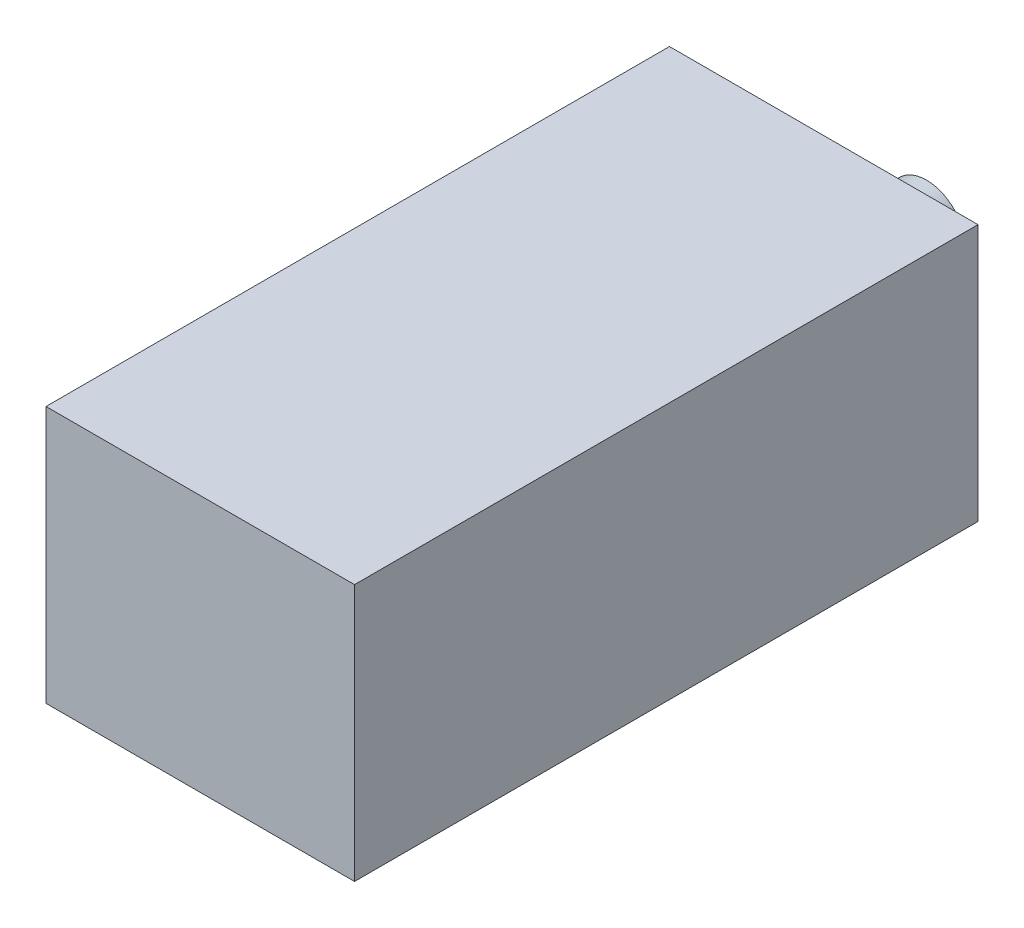
ISO-10303-21;
HEADER;
FILE_DESCRIPTION(('STEP AP214'),'2;1');
FILE_NAME('part.step','',(''),(''),'','','');
FILE_SCHEMA(('AUTOMOTIVE_DESIGN { 1 0 10303 214 1 1 1 1 }'));
ENDSEC;
DATA;
#1=APPLICATION_CONTEXT('core data for automotive mechanical design processes');
#2=APPLICATION_PROTOCOL_DEFINITION('international standard','automotive_design',2000,#1);
#3=PRODUCT_CONTEXT('',#1,'mechanical');
#4=PRODUCT('Part','Part','',(#3));
#5=PRODUCT_RELATED_PRODUCT_CATEGORY('part','',(#4));
#6=PRODUCT_DEFINITION_FORMATION('','',#4);
#7=PRODUCT_DEFINITION_CONTEXT('part definition',#1,'design');
#8=PRODUCT_DEFINITION('design','',#6,#7);
#9=PRODUCT_DEFINITION_SHAPE('','',#8);
#10=(LENGTH_UNIT() NAMED_UNIT(*) SI_UNIT(.MILLI.,.METRE.));
#11=(NAMED_UNIT(*) PLANE_ANGLE_UNIT() SI_UNIT($,.RADIAN.));
#12=(NAMED_UNIT(*) SI_UNIT($,.STERADIAN.) SOLID_ANGLE_UNIT());
#13=UNCERTAINTY_MEASURE_WITH_UNIT(LENGTH_MEASURE(1.E-05),#10,'distance_accuracy_value','');
#14=(GEOMETRIC_REPRESENTATION_CONTEXT(3) GLOBAL_UNCERTAINTY_ASSIGNED_CONTEXT((#13)) GLOBAL_UNIT_ASSIGNED_CONTEXT((#10,
#11,#12)) REPRESENTATION_CONTEXT('',''));
#15=CARTESIAN_POINT('',(0.,0.,0.));
#16=DIRECTION('',(0.,0.,1.));
#17=DIRECTION('',(1.,0.,0.));
#18=AXIS2_PLACEMENT_3D('',#15,#16,#17);
#19=CARTESIAN_POINT('',(0.,0.,24.25));
#20=DIRECTION('',(1.,0.,0.));
#21=DIRECTION('',(0.,1.,0.));
#22=AXIS2_PLACEMENT_3D('',#19,#20,#21);
#23=PLANE('',#22);
#24=DIRECTION('',(0.,-1.,0.));
#25=VECTOR('',#24,1.);
#26=CARTESIAN_POINT('',(0.,0.,0.));
#27=LINE('',#26,#25);
#28=CARTESIAN_POINT('',(0.,0.,0.));
#29=VERTEX_POINT('',#28);
#30=CARTESIAN_POINT('',(0.,-10.,0.));
#31=VERTEX_POINT('',#30);
#32=EDGE_CURVE('E110',#29,#31,#27,.T.);
#33=ORIENTED_EDGE('',*,*,#32,.T.);
#34=DIRECTION('',(0.,0.,-1.));
#35=VECTOR('',#34,1.);
#36=CARTESIAN_POINT('',(0.,-10.,24.25));
#37=LINE('',#36,#35);
#38=CARTESIAN_POINT('',(0.,-10.,24.25));
#39=VERTEX_POINT('',#38);
#40=EDGE_CURVE('E48',#39,#31,#37,.T.);
#41=ORIENTED_EDGE('',*,*,#40,.F.);
#42=DIRECTION('',(0.,-1.,0.));
#43=VECTOR('',#42,1.);
#44=CARTESIAN_POINT('',(0.,0.,24.25));
#45=LINE('',#44,#43);
#46=CARTESIAN_POINT('',(0.,0.,24.25));
#47=VERTEX_POINT('',#46);
#48=EDGE_CURVE('E92',#47,#39,#45,.T.);
#49=ORIENTED_EDGE('',*,*,#48,.F.);
#50=DIRECTION('',(0.,0.,-1.));
#51=VECTOR('',#50,1.);
#52=CARTESIAN_POINT('',(0.,0.,24.25));
#53=LINE('',#52,#51);
#54=EDGE_CURVE('E106',#47,#29,#53,.T.);
#55=ORIENTED_EDGE('',*,*,#54,.T.);
#56=EDGE_LOOP('',(#33,#41,#49,#55));
#57=FACE_BOUND('',#56,.T.);
#58=ADVANCED_FACE('F39',(#57),#23,.F.);
#59=CARTESIAN_POINT('',(0.,-10.,24.25));
#60=DIRECTION('',(0.,1.,0.));
#61=DIRECTION('',(0.,0.,1.));
#62=AXIS2_PLACEMENT_3D('',#59,#60,#61);
#63=PLANE('',#62);
#64=DIRECTION('',(1.,0.,0.));
#65=VECTOR('',#64,1.);
#66=CARTESIAN_POINT('',(0.,-10.,0.));
#67=LINE('',#66,#65);
#68=CARTESIAN_POINT('',(12.,-10.,0.));
#69=VERTEX_POINT('',#68);
#70=EDGE_CURVE('E98',#31,#69,#67,.T.);
#71=ORIENTED_EDGE('',*,*,#70,.T.);
#72=DIRECTION('',(0.,0.,-1.));
#73=VECTOR('',#72,1.);
#74=CARTESIAN_POINT('',(12.,-10.,24.25));
#75=LINE('',#74,#73);
#76=CARTESIAN_POINT('',(12.,-10.,24.25));
#77=VERTEX_POINT('',#76);
#78=EDGE_CURVE('E96',#77,#69,#75,.T.);
#79=ORIENTED_EDGE('',*,*,#78,.F.);
#80=DIRECTION('',(1.,0.,0.));
#81=VECTOR('',#80,1.);
#82=CARTESIAN_POINT('',(0.,-10.,24.25));
#83=LINE('',#82,#81);
#84=EDGE_CURVE('E87',#39,#77,#83,.T.);
#85=ORIENTED_EDGE('',*,*,#84,.F.);
#86=ORIENTED_EDGE('',*,*,#40,.T.);
#87=EDGE_LOOP('',(#71,#79,#85,#86));
#88=FACE_BOUND('',#87,.T.);
#89=ADVANCED_FACE('F97',(#88),#63,.F.);
#90=CARTESIAN_POINT('',(12.,0.,24.25));
#91=DIRECTION('',(-1.,0.,0.));
#92=DIRECTION('',(0.,-1.,0.));
#93=AXIS2_PLACEMENT_3D('',#90,#91,#92);
#94=PLANE('',#93);
#95=DIRECTION('',(0.,1.,0.));
#96=VECTOR('',#95,1.);
#97=CARTESIAN_POINT('',(12.,0.,0.));
#98=LINE('',#97,#96);
#99=CARTESIAN_POINT('',(12.,0.,0.));
#100=VERTEX_POINT('',#99);
#101=EDGE_CURVE('E73',#69,#100,#98,.T.);
#102=ORIENTED_EDGE('',*,*,#101,.T.);
#103=DIRECTION('',(0.,0.,-1.));
#104=VECTOR('',#103,1.);
#105=CARTESIAN_POINT('',(12.,0.,24.25));
#106=LINE('',#105,#104);
#107=CARTESIAN_POINT('',(12.,0.,24.25));
#108=VERTEX_POINT('',#107);
#109=EDGE_CURVE('E100',#108,#100,#106,.T.);
#110=ORIENTED_EDGE('',*,*,#109,.F.);
#111=DIRECTION('',(0.,1.,0.));
#112=VECTOR('',#111,1.);
#113=CARTESIAN_POINT('',(12.,0.,24.25));
#114=LINE('',#113,#112);
#115=EDGE_CURVE('E90',#77,#108,#114,.T.);
#116=ORIENTED_EDGE('',*,*,#115,.F.);
#117=ORIENTED_EDGE('',*,*,#78,.T.);
#118=EDGE_LOOP('',(#102,#110,#116,#117));
#119=FACE_BOUND('',#118,.T.);
#120=ADVANCED_FACE('F102',(#119),#94,.F.);
#121=CARTESIAN_POINT('',(0.,0.,24.25));
#122=DIRECTION('',(0.,-1.,0.));
#123=DIRECTION('',(0.,0.,-1.));
#124=AXIS2_PLACEMENT_3D('',#121,#122,#123);
#125=PLANE('',#124);
#126=DIRECTION('',(-1.,0.,0.));
#127=VECTOR('',#126,1.);
#128=CARTESIAN_POINT('',(0.,0.,0.));
#129=LINE('',#128,#127);
#130=EDGE_CURVE('E79',#100,#29,#129,.T.);
#131=ORIENTED_EDGE('',*,*,#130,.T.);
#132=ORIENTED_EDGE('',*,*,#54,.F.);
#133=DIRECTION('',(-1.,0.,0.));
#134=VECTOR('',#133,1.);
#135=CARTESIAN_POINT('',(0.,0.,24.25));
#136=LINE('',#135,#134);
#137=EDGE_CURVE('E56',#108,#47,#136,.T.);
#138=ORIENTED_EDGE('',*,*,#137,.F.);
#139=ORIENTED_EDGE('',*,*,#109,.T.);
#140=EDGE_LOOP('',(#131,#132,#138,#139));
#141=FACE_BOUND('',#140,.T.);
#142=ADVANCED_FACE('F140',(#141),#125,.F.);
#143=CARTESIAN_POINT('',(0.,0.,24.25));
#144=DIRECTION('',(0.,0.,1.));
#145=DIRECTION('',(1.,0.,0.));
#146=AXIS2_PLACEMENT_3D('',#143,#144,#145);
#147=PLANE('',#146);
#148=ORIENTED_EDGE('',*,*,#48,.T.);
#149=ORIENTED_EDGE('',*,*,#84,.T.);
#150=ORIENTED_EDGE('',*,*,#115,.T.);
#151=ORIENTED_EDGE('',*,*,#137,.T.);
#152=EDGE_LOOP('',(#148,#149,#150,#151));
#153=FACE_BOUND('',#152,.T.);
#154=ADVANCED_FACE('F88',(#153),#147,.T.);
#155=CARTESIAN_POINT('',(0.,0.,0.));
#156=DIRECTION('',(0.,0.,1.));
#157=DIRECTION('',(1.,0.,0.));
#158=AXIS2_PLACEMENT_3D('',#155,#156,#157);
#159=PLANE('',#158);
#160=CARTESIAN_POINT('',(6.,-5.,0.));
#161=DIRECTION('',(0.,0.,1.));
#162=DIRECTION('',(1.,0.,0.));
#163=AXIS2_PLACEMENT_3D('',#160,#161,#162);
#164=CIRCLE('',#163,1.5);
#165=CARTESIAN_POINT('',(7.5,-5.,0.));
#166=VERTEX_POINT('',#165);
#167=EDGE_CURVE('E11',#166,#166,#164,.F.);
#168=ORIENTED_EDGE('',*,*,#167,.F.);
#169=EDGE_LOOP('',(#168));
#170=FACE_BOUND('',#169,.T.);
#171=CARTESIAN_POINT('',(10.5,-5.,0.));
#172=DIRECTION('',(0.,0.,-1.));
#173=DIRECTION('',(-1.,0.,0.));
#174=AXIS2_PLACEMENT_3D('',#171,#172,#173);
#175=CIRCLE('',#174,0.500000000000001);
#176=CARTESIAN_POINT('',(10.,-5.,0.));
#177=VERTEX_POINT('',#176);
#178=EDGE_CURVE('E239',#177,#177,#175,.T.);
#179=ORIENTED_EDGE('',*,*,#178,.F.);
#180=EDGE_LOOP('',(#179));
#181=FACE_BOUND('',#180,.T.);
#182=CARTESIAN_POINT('',(1.5,-5.,0.));
#183=DIRECTION('',(0.,0.,-1.));
#184=DIRECTION('',(-1.,0.,0.));
#185=AXIS2_PLACEMENT_3D('',#182,#183,#184);
#186=CIRCLE('',#185,0.5);
#187=CARTESIAN_POINT('',(1.,-5.,0.));
#188=VERTEX_POINT('',#187);
#189=EDGE_CURVE('E229',#188,#188,#186,.T.);
#190=ORIENTED_EDGE('',*,*,#189,.F.);
#191=EDGE_LOOP('',(#190));
#192=FACE_BOUND('',#191,.T.);
#193=ORIENTED_EDGE('',*,*,#32,.F.);
#194=ORIENTED_EDGE('',*,*,#130,.F.);
#195=ORIENTED_EDGE('',*,*,#101,.F.);
#196=ORIENTED_EDGE('',*,*,#70,.F.);
#197=EDGE_LOOP('',(#193,#194,#195,#196));
#198=FACE_BOUND('',#197,.T.);
#199=ADVANCED_FACE('F128',(#170,#181,#192,#198),#159,.F.);
#200=CARTESIAN_POINT('',(1.5,-5.,10.));
#201=DIRECTION('',(0.,0.,-1.));
#202=DIRECTION('',(-1.,0.,0.));
#203=AXIS2_PLACEMENT_3D('',#200,#201,#202);
#204=CYLINDRICAL_SURFACE('',#203,0.5);
#205=CARTESIAN_POINT('',(1.5,-5.,10.));
#206=DIRECTION('',(0.,0.,-1.));
#207=DIRECTION('',(-1.,0.,0.));
#208=AXIS2_PLACEMENT_3D('',#205,#206,#207);
#209=CIRCLE('',#208,0.5);
#210=CARTESIAN_POINT('',(1.,-5.,10.));
#211=VERTEX_POINT('',#210);
#212=EDGE_CURVE('E233',#211,#211,#209,.T.);
#213=ORIENTED_EDGE('',*,*,#212,.F.);
#214=EDGE_LOOP('',(#213));
#215=FACE_BOUND('',#214,.T.);
#216=ORIENTED_EDGE('',*,*,#189,.T.);
#217=EDGE_LOOP('',(#216));
#218=FACE_BOUND('',#217,.T.);
#219=ADVANCED_FACE('F130',(#215,#218),#204,.F.);
#220=CARTESIAN_POINT('',(1.5,-5.,10.));
#221=DIRECTION('',(0.,0.,-1.));
#222=DIRECTION('',(-1.,0.,0.));
#223=AXIS2_PLACEMENT_3D('',#220,#221,#222);
#224=PLANE('',#223);
#225=ORIENTED_EDGE('',*,*,#212,.T.);
#226=EDGE_LOOP('',(#225));
#227=FACE_BOUND('',#226,.T.);
#228=ADVANCED_FACE('F137',(#227),#224,.T.);
#229=CARTESIAN_POINT('',(10.5,-5.,10.));
#230=DIRECTION('',(0.,0.,-1.));
#231=DIRECTION('',(-1.,0.,0.));
#232=AXIS2_PLACEMENT_3D('',#229,#230,#231);
#233=CYLINDRICAL_SURFACE('',#232,0.500000000000001);
#234=CARTESIAN_POINT('',(10.5,-5.,10.));
#235=DIRECTION('',(0.,0.,-1.));
#236=DIRECTION('',(-1.,0.,0.));
#237=AXIS2_PLACEMENT_3D('',#234,#235,#236);
#238=CIRCLE('',#237,0.500000000000001);
#239=CARTESIAN_POINT('',(10.,-5.,10.));
#240=VERTEX_POINT('',#239);
#241=EDGE_CURVE('E114',#240,#240,#238,.T.);
#242=ORIENTED_EDGE('',*,*,#241,.F.);
#243=EDGE_LOOP('',(#242));
#244=FACE_BOUND('',#243,.T.);
#245=ORIENTED_EDGE('',*,*,#178,.T.);
#246=EDGE_LOOP('',(#245));
#247=FACE_BOUND('',#246,.T.);
#248=ADVANCED_FACE('F178',(#244,#247),#233,.F.);
#249=CARTESIAN_POINT('',(10.5,-5.,10.));
#250=DIRECTION('',(0.,0.,-1.));
#251=DIRECTION('',(-1.,0.,0.));
#252=AXIS2_PLACEMENT_3D('',#249,#250,#251);
#253=PLANE('',#252);
#254=ORIENTED_EDGE('',*,*,#241,.T.);
#255=EDGE_LOOP('',(#254));
#256=FACE_BOUND('',#255,.T.);
#257=ADVANCED_FACE('F188',(#256),#253,.T.);
#258=CARTESIAN_POINT('',(6.,-5.,-4.));
#259=DIRECTION('',(0.,0.,1.));
#260=DIRECTION('',(1.,0.,0.));
#261=AXIS2_PLACEMENT_3D('',#258,#259,#260);
#262=CYLINDRICAL_SURFACE('',#261,1.5);
#263=CARTESIAN_POINT('',(6.,-5.,-4.));
#264=DIRECTION('',(0.,0.,-1.));
#265=DIRECTION('',(-1.,0.,0.));
#266=AXIS2_PLACEMENT_3D('',#263,#264,#265);
#267=CIRCLE('',#266,1.5);
#268=CARTESIAN_POINT('',(4.5,-5.,-4.));
#269=VERTEX_POINT('',#268);
#270=EDGE_CURVE('E227',#269,#269,#267,.T.);
#271=ORIENTED_EDGE('',*,*,#270,.F.);
#272=EDGE_LOOP('',(#271));
#273=FACE_BOUND('',#272,.T.);
#274=ORIENTED_EDGE('',*,*,#167,.T.);
#275=EDGE_LOOP('',(#274));
#276=FACE_BOUND('',#275,.T.);
#277=ADVANCED_FACE('F197',(#273,#276),#262,.T.);
#278=CARTESIAN_POINT('',(6.,-5.,-4.));
#279=DIRECTION('',(0.,0.,-1.));
#280=DIRECTION('',(-1.,0.,0.));
#281=AXIS2_PLACEMENT_3D('',#278,#279,#280);
#282=PLANE('',#281);
#283=ORIENTED_EDGE('',*,*,#270,.T.);
#284=EDGE_LOOP('',(#283));
#285=FACE_BOUND('',#284,.T.);
#286=ADVANCED_FACE('F211',(#285),#282,.T.);
#287=CLOSED_SHELL('',(#58,#89,#120,#142,#154,#199,#219,#228,#248,#257,#277,#286));
#288=MANIFOLD_SOLID_BREP('B2',#287);
#289=ADVANCED_BREP_SHAPE_REPRESENTATION('',(#18,#288),#14);
#290=SHAPE_DEFINITION_REPRESENTATION(#9,#289);
ENDSEC;
END-ISO-10303-21;
